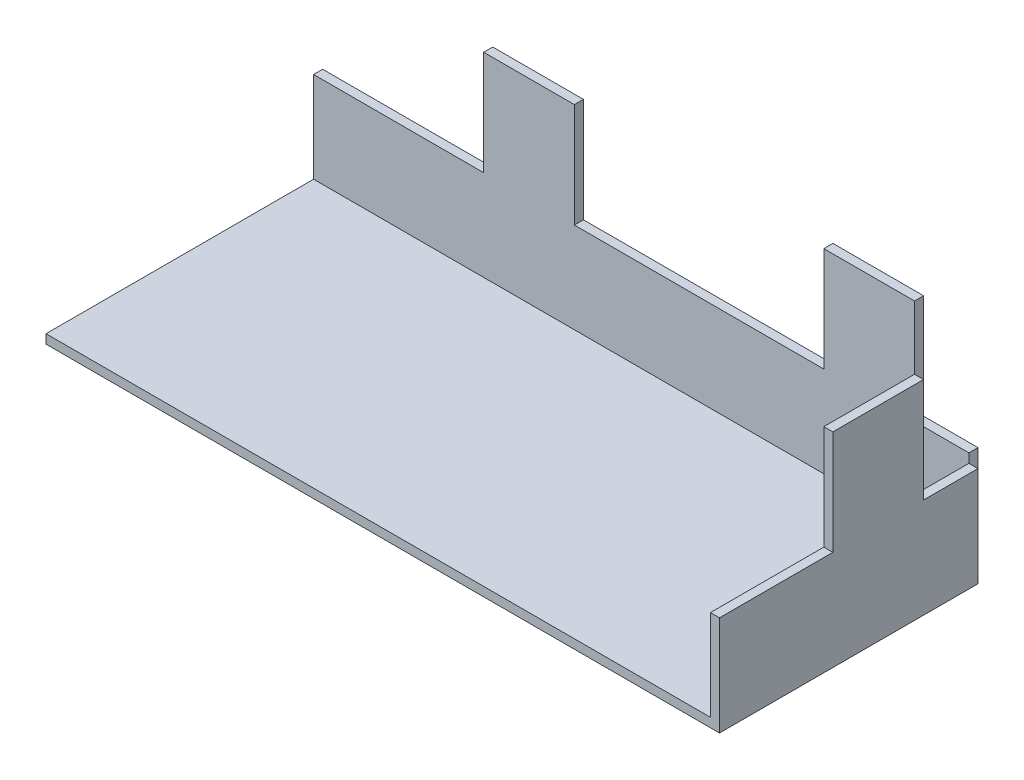
ISO-10303-21;
HEADER;
FILE_DESCRIPTION(('STEP AP214'),'2;1');
FILE_NAME('part.step','',(''),(''),'','','');
FILE_SCHEMA(('AUTOMOTIVE_DESIGN { 1 0 10303 214 1 1 1 1 }'));
ENDSEC;
DATA;
#1=APPLICATION_CONTEXT('core data for automotive mechanical design processes');
#2=APPLICATION_PROTOCOL_DEFINITION('international standard','automotive_design',2000,#1);
#3=PRODUCT_CONTEXT('',#1,'mechanical');
#4=PRODUCT('Part','Part','',(#3));
#5=PRODUCT_RELATED_PRODUCT_CATEGORY('part','',(#4));
#6=PRODUCT_DEFINITION_FORMATION('','',#4);
#7=PRODUCT_DEFINITION_CONTEXT('part definition',#1,'design');
#8=PRODUCT_DEFINITION('design','',#6,#7);
#9=PRODUCT_DEFINITION_SHAPE('','',#8);
#10=(LENGTH_UNIT() NAMED_UNIT(*) SI_UNIT(.MILLI.,.METRE.));
#11=(NAMED_UNIT(*) PLANE_ANGLE_UNIT() SI_UNIT($,.RADIAN.));
#12=(NAMED_UNIT(*) SI_UNIT($,.STERADIAN.) SOLID_ANGLE_UNIT());
#13=UNCERTAINTY_MEASURE_WITH_UNIT(LENGTH_MEASURE(1.E-05),#10,'distance_accuracy_value','');
#14=(GEOMETRIC_REPRESENTATION_CONTEXT(3) GLOBAL_UNCERTAINTY_ASSIGNED_CONTEXT((#13)) GLOBAL_UNIT_ASSIGNED_CONTEXT((#10,
#11,#12)) REPRESENTATION_CONTEXT('',''));
#15=CARTESIAN_POINT('',(0.,0.,0.));
#16=DIRECTION('',(0.,0.,1.));
#17=DIRECTION('',(1.,0.,0.));
#18=AXIS2_PLACEMENT_3D('',#15,#16,#17);
#19=CARTESIAN_POINT('',(0.,0.,-6.1));
#20=DIRECTION('',(0.,0.,-1.));
#21=DIRECTION('',(-1.,0.,0.));
#22=AXIS2_PLACEMENT_3D('',#19,#20,#21);
#23=PLANE('',#22);
#24=DIRECTION('',(0.,-1.,0.));
#25=VECTOR('',#24,1.);
#26=CARTESIAN_POINT('',(14.85,0.,-6.1));
#27=LINE('',#26,#25);
#28=CARTESIAN_POINT('',(14.85,0.,-6.10000000000355));
#29=VERTEX_POINT('',#28);
#30=CARTESIAN_POINT('',(14.85,-0.2,-6.10000000000355));
#31=VERTEX_POINT('',#30);
#32=EDGE_CURVE('E40',#29,#31,#27,.T.);
#33=ORIENTED_EDGE('',*,*,#32,.T.);
#34=DIRECTION('',(1.,0.,0.));
#35=VECTOR('',#34,1.);
#36=CARTESIAN_POINT('',(0.,-0.2,-6.1));
#37=LINE('',#36,#35);
#38=CARTESIAN_POINT('',(29.7,-0.2,-6.1));
#39=VERTEX_POINT('',#38);
#40=EDGE_CURVE('E138',#31,#39,#37,.T.);
#41=ORIENTED_EDGE('',*,*,#40,.T.);
#42=DIRECTION('',(0.,-1.,0.));
#43=VECTOR('',#42,1.);
#44=CARTESIAN_POINT('',(29.7,2.,-6.1));
#45=LINE('',#44,#43);
#46=CARTESIAN_POINT('',(29.7,2.,-6.1));
#47=VERTEX_POINT('',#46);
#48=EDGE_CURVE('E164',#47,#39,#45,.T.);
#49=ORIENTED_EDGE('',*,*,#48,.F.);
#50=DIRECTION('',(1.,0.,0.));
#51=VECTOR('',#50,1.);
#52=CARTESIAN_POINT('',(0.,2.,-6.1));
#53=LINE('',#52,#51);
#54=CARTESIAN_POINT('',(29.5,2.,-6.1));
#55=VERTEX_POINT('',#54);
#56=EDGE_CURVE('E173',#55,#47,#53,.T.);
#57=ORIENTED_EDGE('',*,*,#56,.F.);
#58=DIRECTION('',(0.,-1.,0.));
#59=VECTOR('',#58,1.);
#60=CARTESIAN_POINT('',(29.5,2.,-6.1));
#61=LINE('',#60,#59);
#62=CARTESIAN_POINT('',(29.5,0.,-6.1));
#63=VERTEX_POINT('',#62);
#64=EDGE_CURVE('E143',#55,#63,#61,.T.);
#65=ORIENTED_EDGE('',*,*,#64,.T.);
#66=DIRECTION('',(1.,0.,0.));
#67=VECTOR('',#66,1.);
#68=CARTESIAN_POINT('',(0.,0.,-6.1));
#69=LINE('',#68,#67);
#70=EDGE_CURVE('E137',#29,#63,#69,.T.);
#71=ORIENTED_EDGE('',*,*,#70,.F.);
#72=EDGE_LOOP('',(#33,#41,#49,#57,#65,#71));
#73=FACE_BOUND('',#72,.T.);
#74=ADVANCED_FACE('F36',(#73),#23,.F.);
#75=CARTESIAN_POINT('',(14.85,0.,0.));
#76=DIRECTION('',(-1.,0.,0.));
#77=DIRECTION('',(0.,0.,1.));
#78=AXIS2_PLACEMENT_3D('',#75,#76,#77);
#79=PLANE('',#78);
#80=ORIENTED_EDGE('',*,*,#32,.F.);
#81=DIRECTION('',(0.,0.,-1.));
#82=VECTOR('',#81,1.);
#83=CARTESIAN_POINT('',(14.85,0.,0.));
#84=LINE('',#83,#82);
#85=CARTESIAN_POINT('',(14.85,0.,-12.));
#86=VERTEX_POINT('',#85);
#87=EDGE_CURVE('E134',#29,#86,#84,.T.);
#88=ORIENTED_EDGE('',*,*,#87,.T.);
#89=DIRECTION('',(0.,-1.,0.));
#90=VECTOR('',#89,1.);
#91=CARTESIAN_POINT('',(14.85,2.,-12.));
#92=LINE('',#91,#90);
#93=CARTESIAN_POINT('',(14.85,2.,-12.));
#94=VERTEX_POINT('',#93);
#95=EDGE_CURVE('E167',#94,#86,#92,.T.);
#96=ORIENTED_EDGE('',*,*,#95,.F.);
#97=DIRECTION('',(0.,0.,-1.));
#98=VECTOR('',#97,1.);
#99=CARTESIAN_POINT('',(14.85,2.,0.));
#100=LINE('',#99,#98);
#101=CARTESIAN_POINT('',(14.85,2.,-12.2));
#102=VERTEX_POINT('',#101);
#103=EDGE_CURVE('E145',#94,#102,#100,.T.);
#104=ORIENTED_EDGE('',*,*,#103,.T.);
#105=DIRECTION('',(0.,-1.,0.));
#106=VECTOR('',#105,1.);
#107=CARTESIAN_POINT('',(14.85,2.,-12.2));
#108=LINE('',#107,#106);
#109=CARTESIAN_POINT('',(14.85,-0.2,-12.2));
#110=VERTEX_POINT('',#109);
#111=EDGE_CURVE('E141',#102,#110,#108,.T.);
#112=ORIENTED_EDGE('',*,*,#111,.T.);
#113=DIRECTION('',(0.,0.,-1.));
#114=VECTOR('',#113,1.);
#115=CARTESIAN_POINT('',(14.85,-0.2,0.));
#116=LINE('',#115,#114);
#117=EDGE_CURVE('E90',#31,#110,#116,.T.);
#118=ORIENTED_EDGE('',*,*,#117,.F.);
#119=EDGE_LOOP('',(#80,#88,#96,#104,#112,#118));
#120=FACE_BOUND('',#119,.T.);
#121=ADVANCED_FACE('F163',(#120),#79,.T.);
#122=CARTESIAN_POINT('',(0.,0.,0.));
#123=DIRECTION('',(0.,-1.,0.));
#124=DIRECTION('',(0.,0.,-1.));
#125=AXIS2_PLACEMENT_3D('',#122,#123,#124);
#126=PLANE('',#125);
#127=ORIENTED_EDGE('',*,*,#87,.F.);
#128=ORIENTED_EDGE('',*,*,#70,.T.);
#129=DIRECTION('',(0.,0.,-1.));
#130=VECTOR('',#129,1.);
#131=CARTESIAN_POINT('',(29.5,0.,-0.2));
#132=LINE('',#131,#130);
#133=CARTESIAN_POINT('',(29.5,0.,-11.8));
#134=VERTEX_POINT('',#133);
#135=EDGE_CURVE('E116',#63,#134,#132,.T.);
#136=ORIENTED_EDGE('',*,*,#135,.T.);
#137=DIRECTION('',(1.,0.,0.));
#138=VECTOR('',#137,1.);
#139=CARTESIAN_POINT('',(0.,0.,-11.8));
#140=LINE('',#139,#138);
#141=CARTESIAN_POINT('',(29.3,0.,-11.8));
#142=VERTEX_POINT('',#141);
#143=EDGE_CURVE('E94',#142,#134,#140,.T.);
#144=ORIENTED_EDGE('',*,*,#143,.F.);
#145=DIRECTION('',(0.,0.,1.));
#146=VECTOR('',#145,1.);
#147=CARTESIAN_POINT('',(29.3,0.,0.));
#148=LINE('',#147,#146);
#149=CARTESIAN_POINT('',(29.3,0.,-12.));
#150=VERTEX_POINT('',#149);
#151=EDGE_CURVE('E107',#150,#142,#148,.T.);
#152=ORIENTED_EDGE('',*,*,#151,.F.);
#153=DIRECTION('',(-1.,0.,0.));
#154=VECTOR('',#153,1.);
#155=CARTESIAN_POINT('',(0.2,0.,-12.));
#156=LINE('',#155,#154);
#157=EDGE_CURVE('E121',#150,#86,#156,.T.);
#158=ORIENTED_EDGE('',*,*,#157,.T.);
#159=EDGE_LOOP('',(#127,#128,#136,#144,#152,#158));
#160=FACE_BOUND('',#159,.T.);
#161=ADVANCED_FACE('F404',(#160),#126,.F.);
#162=CARTESIAN_POINT('',(0.,-0.2,0.));
#163=DIRECTION('',(0.,-1.,0.));
#164=DIRECTION('',(0.,0.,-1.));
#165=AXIS2_PLACEMENT_3D('',#162,#163,#164);
#166=PLANE('',#165);
#167=ORIENTED_EDGE('',*,*,#40,.F.);
#168=ORIENTED_EDGE('',*,*,#117,.T.);
#169=DIRECTION('',(1.,0.,0.));
#170=VECTOR('',#169,1.);
#171=CARTESIAN_POINT('',(0.,-0.2,-12.2));
#172=LINE('',#171,#170);
#173=CARTESIAN_POINT('',(29.3,-0.2,-12.2));
#174=VERTEX_POINT('',#173);
#175=EDGE_CURVE('E85',#110,#174,#172,.T.);
#176=ORIENTED_EDGE('',*,*,#175,.T.);
#177=DIRECTION('',(0.,0.,1.));
#178=VECTOR('',#177,1.);
#179=CARTESIAN_POINT('',(29.3,-0.2,-12.2));
#180=LINE('',#179,#178);
#181=CARTESIAN_POINT('',(29.3,-0.2,-11.8));
#182=VERTEX_POINT('',#181);
#183=EDGE_CURVE('E46',#174,#182,#180,.T.);
#184=ORIENTED_EDGE('',*,*,#183,.T.);
#185=DIRECTION('',(1.,0.,0.));
#186=VECTOR('',#185,1.);
#187=CARTESIAN_POINT('',(29.7,-0.2,-11.8));
#188=LINE('',#187,#186);
#189=CARTESIAN_POINT('',(29.7,-0.2,-11.8));
#190=VERTEX_POINT('',#189);
#191=EDGE_CURVE('E11',#182,#190,#188,.T.);
#192=ORIENTED_EDGE('',*,*,#191,.T.);
#193=DIRECTION('',(0.,0.,1.));
#194=VECTOR('',#193,1.);
#195=CARTESIAN_POINT('',(29.7,-0.2,0.));
#196=LINE('',#195,#194);
#197=EDGE_CURVE('E95',#190,#39,#196,.T.);
#198=ORIENTED_EDGE('',*,*,#197,.T.);
#199=EDGE_LOOP('',(#167,#168,#176,#184,#192,#198));
#200=FACE_BOUND('',#199,.T.);
#201=ADVANCED_FACE('F87',(#200),#166,.T.);
#202=CARTESIAN_POINT('',(0.,2.,-12.2));
#203=DIRECTION('',(0.,0.,1.));
#204=DIRECTION('',(1.,0.,0.));
#205=AXIS2_PLACEMENT_3D('',#202,#203,#204);
#206=PLANE('',#205);
#207=ORIENTED_EDGE('',*,*,#111,.F.);
#208=DIRECTION('',(-1.,0.,0.));
#209=VECTOR('',#208,1.);
#210=CARTESIAN_POINT('',(0.,2.,-12.2));
#211=LINE('',#210,#209);
#212=CARTESIAN_POINT('',(18.6,2.,-12.2));
#213=VERTEX_POINT('',#212);
#214=EDGE_CURVE('E133',#213,#102,#211,.T.);
#215=ORIENTED_EDGE('',*,*,#214,.F.);
#216=DIRECTION('',(0.,-1.,0.));
#217=VECTOR('',#216,1.);
#218=CARTESIAN_POINT('',(18.6,4.3,-12.2));
#219=LINE('',#218,#217);
#220=CARTESIAN_POINT('',(18.6,4.3,-12.2));
#221=VERTEX_POINT('',#220);
#222=EDGE_CURVE('E233',#221,#213,#219,.T.);
#223=ORIENTED_EDGE('',*,*,#222,.F.);
#224=DIRECTION('',(1.,0.,0.));
#225=VECTOR('',#224,1.);
#226=CARTESIAN_POINT('',(20.6,4.3,-12.2));
#227=LINE('',#226,#225);
#228=CARTESIAN_POINT('',(20.6,4.3,-12.2));
#229=VERTEX_POINT('',#228);
#230=EDGE_CURVE('E263',#221,#229,#227,.T.);
#231=ORIENTED_EDGE('',*,*,#230,.T.);
#232=DIRECTION('',(0.,-1.,0.));
#233=VECTOR('',#232,1.);
#234=CARTESIAN_POINT('',(20.6,4.3,-12.2));
#235=LINE('',#234,#233);
#236=CARTESIAN_POINT('',(20.6,2.,-12.2));
#237=VERTEX_POINT('',#236);
#238=EDGE_CURVE('E215',#229,#237,#235,.T.);
#239=ORIENTED_EDGE('',*,*,#238,.T.);
#240=CARTESIAN_POINT('',(26.1,2.,-12.2));
#241=VERTEX_POINT('',#240);
#242=EDGE_CURVE('E182',#241,#237,#211,.T.);
#243=ORIENTED_EDGE('',*,*,#242,.F.);
#244=DIRECTION('',(0.,-1.,0.));
#245=VECTOR('',#244,1.);
#246=CARTESIAN_POINT('',(26.1,4.3,-12.2));
#247=LINE('',#246,#245);
#248=CARTESIAN_POINT('',(26.1,4.3,-12.2));
#249=VERTEX_POINT('',#248);
#250=EDGE_CURVE('E193',#249,#241,#247,.T.);
#251=ORIENTED_EDGE('',*,*,#250,.F.);
#252=DIRECTION('',(1.,0.,0.));
#253=VECTOR('',#252,1.);
#254=CARTESIAN_POINT('',(28.1,4.3,-12.2));
#255=LINE('',#254,#253);
#256=CARTESIAN_POINT('',(28.1,4.3,-12.2));
#257=VERTEX_POINT('',#256);
#258=EDGE_CURVE('E223',#249,#257,#255,.T.);
#259=ORIENTED_EDGE('',*,*,#258,.T.);
#260=DIRECTION('',(0.,-1.,0.));
#261=VECTOR('',#260,1.);
#262=CARTESIAN_POINT('',(28.1,4.3,-12.2));
#263=LINE('',#262,#261);
#264=CARTESIAN_POINT('',(28.1,2.,-12.2));
#265=VERTEX_POINT('',#264);
#266=EDGE_CURVE('E120',#257,#265,#263,.T.);
#267=ORIENTED_EDGE('',*,*,#266,.T.);
#268=CARTESIAN_POINT('',(29.3,2.,-12.2));
#269=VERTEX_POINT('',#268);
#270=EDGE_CURVE('E106',#269,#265,#211,.T.);
#271=ORIENTED_EDGE('',*,*,#270,.F.);
#272=DIRECTION('',(0.,-1.,0.));
#273=VECTOR('',#272,1.);
#274=CARTESIAN_POINT('',(29.3,2.,-12.2));
#275=LINE('',#274,#273);
#276=EDGE_CURVE('E67',#269,#174,#275,.T.);
#277=ORIENTED_EDGE('',*,*,#276,.T.);
#278=ORIENTED_EDGE('',*,*,#175,.F.);
#279=EDGE_LOOP('',(#207,#215,#223,#231,#239,#243,#251,#259,#267,#271,#277,#278));
#280=FACE_BOUND('',#279,.T.);
#281=ADVANCED_FACE('F103',(#280),#206,.F.);
#282=CARTESIAN_POINT('',(0.2,2.,-12.));
#283=DIRECTION('',(0.,0.,1.));
#284=DIRECTION('',(1.,0.,0.));
#285=AXIS2_PLACEMENT_3D('',#282,#283,#284);
#286=PLANE('',#285);
#287=DIRECTION('',(-1.,0.,0.));
#288=VECTOR('',#287,1.);
#289=CARTESIAN_POINT('',(0.2,2.,-12.));
#290=LINE('',#289,#288);
#291=CARTESIAN_POINT('',(18.6,2.,-12.));
#292=VERTEX_POINT('',#291);
#293=EDGE_CURVE('E127',#292,#94,#290,.T.);
#294=ORIENTED_EDGE('',*,*,#293,.T.);
#295=ORIENTED_EDGE('',*,*,#95,.T.);
#296=ORIENTED_EDGE('',*,*,#157,.F.);
#297=DIRECTION('',(0.,1.,0.));
#298=VECTOR('',#297,1.);
#299=CARTESIAN_POINT('',(29.3,2.,-12.));
#300=LINE('',#299,#298);
#301=CARTESIAN_POINT('',(29.3,2.,-12.));
#302=VERTEX_POINT('',#301);
#303=EDGE_CURVE('E177',#150,#302,#300,.T.);
#304=ORIENTED_EDGE('',*,*,#303,.T.);
#305=CARTESIAN_POINT('',(28.1,2.,-12.));
#306=VERTEX_POINT('',#305);
#307=EDGE_CURVE('E186',#302,#306,#290,.T.);
#308=ORIENTED_EDGE('',*,*,#307,.T.);
#309=DIRECTION('',(0.,-1.,0.));
#310=VECTOR('',#309,1.);
#311=CARTESIAN_POINT('',(28.1,4.3,-12.));
#312=LINE('',#311,#310);
#313=CARTESIAN_POINT('',(28.1,4.3,-12.));
#314=VERTEX_POINT('',#313);
#315=EDGE_CURVE('E201',#314,#306,#312,.T.);
#316=ORIENTED_EDGE('',*,*,#315,.F.);
#317=DIRECTION('',(-1.,0.,0.));
#318=VECTOR('',#317,1.);
#319=CARTESIAN_POINT('',(28.1,4.3,-12.));
#320=LINE('',#319,#318);
#321=CARTESIAN_POINT('',(26.1,4.3,-12.));
#322=VERTEX_POINT('',#321);
#323=EDGE_CURVE('E205',#314,#322,#320,.T.);
#324=ORIENTED_EDGE('',*,*,#323,.T.);
#325=DIRECTION('',(0.,-1.,0.));
#326=VECTOR('',#325,1.);
#327=CARTESIAN_POINT('',(26.1,4.3,-12.));
#328=LINE('',#327,#326);
#329=CARTESIAN_POINT('',(26.1,2.,-12.));
#330=VERTEX_POINT('',#329);
#331=EDGE_CURVE('E197',#322,#330,#328,.T.);
#332=ORIENTED_EDGE('',*,*,#331,.T.);
#333=CARTESIAN_POINT('',(20.6,2.,-12.));
#334=VERTEX_POINT('',#333);
#335=EDGE_CURVE('E190',#330,#334,#290,.T.);
#336=ORIENTED_EDGE('',*,*,#335,.T.);
#337=DIRECTION('',(0.,-1.,0.));
#338=VECTOR('',#337,1.);
#339=CARTESIAN_POINT('',(20.6,4.3,-12.));
#340=LINE('',#339,#338);
#341=CARTESIAN_POINT('',(20.6,4.3,-12.));
#342=VERTEX_POINT('',#341);
#343=EDGE_CURVE('E241',#342,#334,#340,.T.);
#344=ORIENTED_EDGE('',*,*,#343,.F.);
#345=DIRECTION('',(-1.,0.,0.));
#346=VECTOR('',#345,1.);
#347=CARTESIAN_POINT('',(20.6,4.3,-12.));
#348=LINE('',#347,#346);
#349=CARTESIAN_POINT('',(18.6,4.3,-12.));
#350=VERTEX_POINT('',#349);
#351=EDGE_CURVE('E245',#342,#350,#348,.T.);
#352=ORIENTED_EDGE('',*,*,#351,.T.);
#353=DIRECTION('',(0.,-1.,0.));
#354=VECTOR('',#353,1.);
#355=CARTESIAN_POINT('',(18.6,4.3,-12.));
#356=LINE('',#355,#354);
#357=EDGE_CURVE('E237',#350,#292,#356,.T.);
#358=ORIENTED_EDGE('',*,*,#357,.T.);
#359=EDGE_LOOP('',(#294,#295,#296,#304,#308,#316,#324,#332,#336,#344,#352,#358));
#360=FACE_BOUND('',#359,.T.);
#361=ADVANCED_FACE('F406',(#360),#286,.T.);
#362=CARTESIAN_POINT('',(0.,2.,0.));
#363=DIRECTION('',(0.,-1.,0.));
#364=DIRECTION('',(0.,0.,-1.));
#365=AXIS2_PLACEMENT_3D('',#362,#363,#364);
#366=PLANE('',#365);
#367=ORIENTED_EDGE('',*,*,#103,.F.);
#368=ORIENTED_EDGE('',*,*,#293,.F.);
#369=DIRECTION('',(0.,0.,-1.));
#370=VECTOR('',#369,1.);
#371=CARTESIAN_POINT('',(18.6,2.,-12.));
#372=LINE('',#371,#370);
#373=EDGE_CURVE('E246',#292,#213,#372,.T.);
#374=ORIENTED_EDGE('',*,*,#373,.T.);
#375=ORIENTED_EDGE('',*,*,#214,.T.);
#376=EDGE_LOOP('',(#367,#368,#374,#375));
#377=FACE_BOUND('',#376,.T.);
#378=ADVANCED_FACE('F436',(#377),#366,.F.);
#379=DIRECTION('',(0.,0.,1.));
#380=VECTOR('',#379,1.);
#381=CARTESIAN_POINT('',(29.3,2.,-12.2));
#382=LINE('',#381,#380);
#383=EDGE_CURVE('E113',#269,#302,#382,.T.);
#384=ORIENTED_EDGE('',*,*,#383,.F.);
#385=ORIENTED_EDGE('',*,*,#270,.T.);
#386=DIRECTION('',(0.,0.,1.));
#387=VECTOR('',#386,1.);
#388=CARTESIAN_POINT('',(28.1,2.,-12.));
#389=LINE('',#388,#387);
#390=EDGE_CURVE('E210',#265,#306,#389,.T.);
#391=ORIENTED_EDGE('',*,*,#390,.T.);
#392=ORIENTED_EDGE('',*,*,#307,.F.);
#393=EDGE_LOOP('',(#384,#385,#391,#392));
#394=FACE_BOUND('',#393,.T.);
#395=ADVANCED_FACE('F433',(#394),#366,.F.);
#396=DIRECTION('',(1.,0.,0.));
#397=VECTOR('',#396,1.);
#398=CARTESIAN_POINT('',(29.7,2.,-11.8));
#399=LINE('',#398,#397);
#400=CARTESIAN_POINT('',(29.5,2.,-11.8));
#401=VERTEX_POINT('',#400);
#402=CARTESIAN_POINT('',(29.7,2.,-11.8));
#403=VERTEX_POINT('',#402);
#404=EDGE_CURVE('E100',#401,#403,#399,.T.);
#405=ORIENTED_EDGE('',*,*,#404,.F.);
#406=DIRECTION('',(0.,0.,-1.));
#407=VECTOR('',#406,1.);
#408=CARTESIAN_POINT('',(29.5,2.,-0.2));
#409=LINE('',#408,#407);
#410=CARTESIAN_POINT('',(29.5,2.,-10.6));
#411=VERTEX_POINT('',#410);
#412=EDGE_CURVE('E126',#411,#401,#409,.T.);
#413=ORIENTED_EDGE('',*,*,#412,.F.);
#414=DIRECTION('',(1.,0.,0.));
#415=VECTOR('',#414,1.);
#416=CARTESIAN_POINT('',(29.5,2.,-10.6));
#417=LINE('',#416,#415);
#418=CARTESIAN_POINT('',(29.7,2.,-10.6));
#419=VERTEX_POINT('',#418);
#420=EDGE_CURVE('E286',#411,#419,#417,.T.);
#421=ORIENTED_EDGE('',*,*,#420,.T.);
#422=DIRECTION('',(0.,0.,-1.));
#423=VECTOR('',#422,1.);
#424=CARTESIAN_POINT('',(29.7,2.,0.));
#425=LINE('',#424,#423);
#426=EDGE_CURVE('E132',#419,#403,#425,.T.);
#427=ORIENTED_EDGE('',*,*,#426,.T.);
#428=EDGE_LOOP('',(#405,#413,#421,#427));
#429=FACE_BOUND('',#428,.T.);
#430=ADVANCED_FACE('F435',(#429),#366,.F.);
#431=CARTESIAN_POINT('',(29.7,2.,0.));
#432=DIRECTION('',(-1.,0.,0.));
#433=DIRECTION('',(0.,0.,1.));
#434=AXIS2_PLACEMENT_3D('',#431,#432,#433);
#435=PLANE('',#434);
#436=CARTESIAN_POINT('',(29.7,2.,-8.6));
#437=VERTEX_POINT('',#436);
#438=EDGE_CURVE('E128',#47,#437,#425,.T.);
#439=ORIENTED_EDGE('',*,*,#438,.F.);
#440=ORIENTED_EDGE('',*,*,#48,.T.);
#441=ORIENTED_EDGE('',*,*,#197,.F.);
#442=DIRECTION('',(0.,-1.,0.));
#443=VECTOR('',#442,1.);
#444=CARTESIAN_POINT('',(29.7,2.,-11.8));
#445=LINE('',#444,#443);
#446=EDGE_CURVE('E55',#403,#190,#445,.T.);
#447=ORIENTED_EDGE('',*,*,#446,.F.);
#448=ORIENTED_EDGE('',*,*,#426,.F.);
#449=DIRECTION('',(0.,-1.,0.));
#450=VECTOR('',#449,1.);
#451=CARTESIAN_POINT('',(29.7,4.3,-10.6));
#452=LINE('',#451,#450);
#453=CARTESIAN_POINT('',(29.7,4.3,-10.6));
#454=VERTEX_POINT('',#453);
#455=EDGE_CURVE('E277',#454,#419,#452,.T.);
#456=ORIENTED_EDGE('',*,*,#455,.F.);
#457=DIRECTION('',(0.,0.,1.));
#458=VECTOR('',#457,1.);
#459=CARTESIAN_POINT('',(29.7,4.3,-10.6));
#460=LINE('',#459,#458);
#461=CARTESIAN_POINT('',(29.7,4.3,-8.6));
#462=VERTEX_POINT('',#461);
#463=EDGE_CURVE('E298',#454,#462,#460,.T.);
#464=ORIENTED_EDGE('',*,*,#463,.T.);
#465=DIRECTION('',(0.,-1.,0.));
#466=VECTOR('',#465,1.);
#467=CARTESIAN_POINT('',(29.7,4.3,-8.6));
#468=LINE('',#467,#466);
#469=EDGE_CURVE('E273',#462,#437,#468,.T.);
#470=ORIENTED_EDGE('',*,*,#469,.T.);
#471=EDGE_LOOP('',(#439,#440,#441,#447,#448,#456,#464,#470));
#472=FACE_BOUND('',#471,.T.);
#473=ADVANCED_FACE('F441',(#472),#435,.F.);
#474=CARTESIAN_POINT('',(29.5,2.,-0.2));
#475=DIRECTION('',(-1.,0.,0.));
#476=DIRECTION('',(0.,0.,1.));
#477=AXIS2_PLACEMENT_3D('',#474,#475,#476);
#478=PLANE('',#477);
#479=ORIENTED_EDGE('',*,*,#64,.F.);
#480=CARTESIAN_POINT('',(29.5,2.,-8.6));
#481=VERTEX_POINT('',#480);
#482=EDGE_CURVE('E122',#55,#481,#409,.T.);
#483=ORIENTED_EDGE('',*,*,#482,.T.);
#484=DIRECTION('',(0.,-1.,0.));
#485=VECTOR('',#484,1.);
#486=CARTESIAN_POINT('',(29.5,4.3,-8.6));
#487=LINE('',#486,#485);
#488=CARTESIAN_POINT('',(29.5,4.3,-8.6));
#489=VERTEX_POINT('',#488);
#490=EDGE_CURVE('E255',#489,#481,#487,.T.);
#491=ORIENTED_EDGE('',*,*,#490,.F.);
#492=DIRECTION('',(0.,0.,-1.));
#493=VECTOR('',#492,1.);
#494=CARTESIAN_POINT('',(29.5,4.3,-10.6));
#495=LINE('',#494,#493);
#496=CARTESIAN_POINT('',(29.5,4.3,-10.6));
#497=VERTEX_POINT('',#496);
#498=EDGE_CURVE('E291',#489,#497,#495,.T.);
#499=ORIENTED_EDGE('',*,*,#498,.T.);
#500=DIRECTION('',(0.,-1.,0.));
#501=VECTOR('',#500,1.);
#502=CARTESIAN_POINT('',(29.5,4.3,-10.6));
#503=LINE('',#502,#501);
#504=EDGE_CURVE('E281',#497,#411,#503,.T.);
#505=ORIENTED_EDGE('',*,*,#504,.T.);
#506=ORIENTED_EDGE('',*,*,#412,.T.);
#507=DIRECTION('',(0.,-1.,0.));
#508=VECTOR('',#507,1.);
#509=CARTESIAN_POINT('',(29.5,2.,-11.8));
#510=LINE('',#509,#508);
#511=EDGE_CURVE('E74',#401,#134,#510,.T.);
#512=ORIENTED_EDGE('',*,*,#511,.T.);
#513=ORIENTED_EDGE('',*,*,#135,.F.);
#514=EDGE_LOOP('',(#479,#483,#491,#499,#505,#506,#512,#513));
#515=FACE_BOUND('',#514,.T.);
#516=ADVANCED_FACE('F321',(#515),#478,.T.);
#517=ORIENTED_EDGE('',*,*,#482,.F.);
#518=ORIENTED_EDGE('',*,*,#56,.T.);
#519=ORIENTED_EDGE('',*,*,#438,.T.);
#520=DIRECTION('',(-1.,0.,0.));
#521=VECTOR('',#520,1.);
#522=CARTESIAN_POINT('',(29.5,2.,-8.6));
#523=LINE('',#522,#521);
#524=EDGE_CURVE('E290',#437,#481,#523,.T.);
#525=ORIENTED_EDGE('',*,*,#524,.T.);
#526=EDGE_LOOP('',(#517,#518,#519,#525));
#527=FACE_BOUND('',#526,.T.);
#528=ADVANCED_FACE('F442',(#527),#366,.F.);
#529=ORIENTED_EDGE('',*,*,#242,.T.);
#530=DIRECTION('',(0.,0.,1.));
#531=VECTOR('',#530,1.);
#532=CARTESIAN_POINT('',(20.6,2.,-12.));
#533=LINE('',#532,#531);
#534=EDGE_CURVE('E250',#237,#334,#533,.T.);
#535=ORIENTED_EDGE('',*,*,#534,.T.);
#536=ORIENTED_EDGE('',*,*,#335,.F.);
#537=DIRECTION('',(0.,0.,-1.));
#538=VECTOR('',#537,1.);
#539=CARTESIAN_POINT('',(26.1,2.,-12.));
#540=LINE('',#539,#538);
#541=EDGE_CURVE('E206',#330,#241,#540,.T.);
#542=ORIENTED_EDGE('',*,*,#541,.T.);
#543=EDGE_LOOP('',(#529,#535,#536,#542));
#544=FACE_BOUND('',#543,.T.);
#545=ADVANCED_FACE('F38',(#544),#366,.F.);
#546=CARTESIAN_POINT('',(28.1,4.3,-12.));
#547=DIRECTION('',(1.,0.,0.));
#548=DIRECTION('',(0.,0.,-1.));
#549=AXIS2_PLACEMENT_3D('',#546,#547,#548);
#550=PLANE('',#549);
#551=ORIENTED_EDGE('',*,*,#390,.F.);
#552=ORIENTED_EDGE('',*,*,#266,.F.);
#553=DIRECTION('',(0.,0.,1.));
#554=VECTOR('',#553,1.);
#555=CARTESIAN_POINT('',(28.1,4.3,-12.));
#556=LINE('',#555,#554);
#557=EDGE_CURVE('E211',#257,#314,#556,.T.);
#558=ORIENTED_EDGE('',*,*,#557,.T.);
#559=ORIENTED_EDGE('',*,*,#315,.T.);
#560=EDGE_LOOP('',(#551,#552,#558,#559));
#561=FACE_BOUND('',#560,.T.);
#562=ADVANCED_FACE('F431',(#561),#550,.T.);
#563=CARTESIAN_POINT('',(26.1,4.3,-12.));
#564=DIRECTION('',(-1.,0.,0.));
#565=DIRECTION('',(0.,0.,1.));
#566=AXIS2_PLACEMENT_3D('',#563,#564,#565);
#567=PLANE('',#566);
#568=ORIENTED_EDGE('',*,*,#541,.F.);
#569=ORIENTED_EDGE('',*,*,#331,.F.);
#570=DIRECTION('',(0.,0.,-1.));
#571=VECTOR('',#570,1.);
#572=CARTESIAN_POINT('',(26.1,4.3,-12.));
#573=LINE('',#572,#571);
#574=EDGE_CURVE('E219',#322,#249,#573,.T.);
#575=ORIENTED_EDGE('',*,*,#574,.T.);
#576=ORIENTED_EDGE('',*,*,#250,.T.);
#577=EDGE_LOOP('',(#568,#569,#575,#576));
#578=FACE_BOUND('',#577,.T.);
#579=ADVANCED_FACE('F423',(#578),#567,.T.);
#580=CARTESIAN_POINT('',(0.,4.3,-12.2));
#581=DIRECTION('',(0.,-1.,0.));
#582=DIRECTION('',(0.,0.,1.));
#583=AXIS2_PLACEMENT_3D('',#580,#581,#582);
#584=PLANE('',#583);
#585=ORIENTED_EDGE('',*,*,#557,.F.);
#586=ORIENTED_EDGE('',*,*,#258,.F.);
#587=ORIENTED_EDGE('',*,*,#574,.F.);
#588=ORIENTED_EDGE('',*,*,#323,.F.);
#589=EDGE_LOOP('',(#585,#586,#587,#588));
#590=FACE_BOUND('',#589,.T.);
#591=ADVANCED_FACE('F428',(#590),#584,.F.);
#592=CARTESIAN_POINT('',(20.6,4.3,-12.));
#593=DIRECTION('',(1.,0.,0.));
#594=DIRECTION('',(0.,0.,-1.));
#595=AXIS2_PLACEMENT_3D('',#592,#593,#594);
#596=PLANE('',#595);
#597=ORIENTED_EDGE('',*,*,#534,.F.);
#598=ORIENTED_EDGE('',*,*,#238,.F.);
#599=DIRECTION('',(0.,0.,1.));
#600=VECTOR('',#599,1.);
#601=CARTESIAN_POINT('',(20.6,4.3,-12.));
#602=LINE('',#601,#600);
#603=EDGE_CURVE('E251',#229,#342,#602,.T.);
#604=ORIENTED_EDGE('',*,*,#603,.T.);
#605=ORIENTED_EDGE('',*,*,#343,.T.);
#606=EDGE_LOOP('',(#597,#598,#604,#605));
#607=FACE_BOUND('',#606,.T.);
#608=ADVANCED_FACE('F545',(#607),#596,.T.);
#609=CARTESIAN_POINT('',(18.6,4.3,-12.));
#610=DIRECTION('',(-1.,0.,0.));
#611=DIRECTION('',(0.,0.,1.));
#612=AXIS2_PLACEMENT_3D('',#609,#610,#611);
#613=PLANE('',#612);
#614=ORIENTED_EDGE('',*,*,#373,.F.);
#615=ORIENTED_EDGE('',*,*,#357,.F.);
#616=DIRECTION('',(0.,0.,-1.));
#617=VECTOR('',#616,1.);
#618=CARTESIAN_POINT('',(18.6,4.3,-12.));
#619=LINE('',#618,#617);
#620=EDGE_CURVE('E259',#350,#221,#619,.T.);
#621=ORIENTED_EDGE('',*,*,#620,.T.);
#622=ORIENTED_EDGE('',*,*,#222,.T.);
#623=EDGE_LOOP('',(#614,#615,#621,#622));
#624=FACE_BOUND('',#623,.T.);
#625=ADVANCED_FACE('F555',(#624),#613,.T.);
#626=CARTESIAN_POINT('',(-7.5,4.3,-12.2));
#627=DIRECTION('',(0.,-1.,0.));
#628=DIRECTION('',(0.,0.,1.));
#629=AXIS2_PLACEMENT_3D('',#626,#627,#628);
#630=PLANE('',#629);
#631=ORIENTED_EDGE('',*,*,#603,.F.);
#632=ORIENTED_EDGE('',*,*,#230,.F.);
#633=ORIENTED_EDGE('',*,*,#620,.F.);
#634=ORIENTED_EDGE('',*,*,#351,.F.);
#635=EDGE_LOOP('',(#631,#632,#633,#634));
#636=FACE_BOUND('',#635,.T.);
#637=ADVANCED_FACE('F566',(#636),#630,.F.);
#638=CARTESIAN_POINT('',(29.5,4.3,-8.6));
#639=DIRECTION('',(0.,0.,1.));
#640=DIRECTION('',(1.,0.,0.));
#641=AXIS2_PLACEMENT_3D('',#638,#639,#640);
#642=PLANE('',#641);
#643=ORIENTED_EDGE('',*,*,#524,.F.);
#644=ORIENTED_EDGE('',*,*,#469,.F.);
#645=DIRECTION('',(-1.,0.,0.));
#646=VECTOR('',#645,1.);
#647=CARTESIAN_POINT('',(29.5,4.3,-8.6));
#648=LINE('',#647,#646);
#649=EDGE_CURVE('E302',#462,#489,#648,.T.);
#650=ORIENTED_EDGE('',*,*,#649,.T.);
#651=ORIENTED_EDGE('',*,*,#490,.T.);
#652=EDGE_LOOP('',(#643,#644,#650,#651));
#653=FACE_BOUND('',#652,.T.);
#654=ADVANCED_FACE('F577',(#653),#642,.T.);
#655=CARTESIAN_POINT('',(29.5,4.3,-10.6));
#656=DIRECTION('',(0.,0.,-1.));
#657=DIRECTION('',(-1.,0.,0.));
#658=AXIS2_PLACEMENT_3D('',#655,#656,#657);
#659=PLANE('',#658);
#660=ORIENTED_EDGE('',*,*,#420,.F.);
#661=ORIENTED_EDGE('',*,*,#504,.F.);
#662=DIRECTION('',(1.,0.,0.));
#663=VECTOR('',#662,1.);
#664=CARTESIAN_POINT('',(29.5,4.3,-10.6));
#665=LINE('',#664,#663);
#666=EDGE_CURVE('E285',#497,#454,#665,.T.);
#667=ORIENTED_EDGE('',*,*,#666,.T.);
#668=ORIENTED_EDGE('',*,*,#455,.T.);
#669=EDGE_LOOP('',(#660,#661,#667,#668));
#670=FACE_BOUND('',#669,.T.);
#671=ADVANCED_FACE('F588',(#670),#659,.T.);
#672=CARTESIAN_POINT('',(0.,4.3,-12.2));
#673=DIRECTION('',(0.,-1.,0.));
#674=DIRECTION('',(0.,0.,1.));
#675=AXIS2_PLACEMENT_3D('',#672,#673,#674);
#676=PLANE('',#675);
#677=ORIENTED_EDGE('',*,*,#498,.F.);
#678=ORIENTED_EDGE('',*,*,#649,.F.);
#679=ORIENTED_EDGE('',*,*,#463,.F.);
#680=ORIENTED_EDGE('',*,*,#666,.F.);
#681=EDGE_LOOP('',(#677,#678,#679,#680));
#682=FACE_BOUND('',#681,.T.);
#683=ADVANCED_FACE('F599',(#682),#676,.F.);
#684=CARTESIAN_POINT('',(29.7,2.,-11.8));
#685=DIRECTION('',(0.,0.,-1.));
#686=DIRECTION('',(-1.,0.,0.));
#687=AXIS2_PLACEMENT_3D('',#684,#685,#686);
#688=PLANE('',#687);
#689=ORIENTED_EDGE('',*,*,#143,.T.);
#690=ORIENTED_EDGE('',*,*,#511,.F.);
#691=ORIENTED_EDGE('',*,*,#404,.T.);
#692=ORIENTED_EDGE('',*,*,#446,.T.);
#693=ORIENTED_EDGE('',*,*,#191,.F.);
#694=DIRECTION('',(0.,-1.,0.));
#695=VECTOR('',#694,1.);
#696=CARTESIAN_POINT('',(29.3,2.,-11.8));
#697=LINE('',#696,#695);
#698=EDGE_CURVE('E99',#142,#182,#697,.T.);
#699=ORIENTED_EDGE('',*,*,#698,.F.);
#700=EDGE_LOOP('',(#689,#690,#691,#692,#693,#699));
#701=FACE_BOUND('',#700,.T.);
#702=ADVANCED_FACE('F312',(#701),#688,.T.);
#703=CARTESIAN_POINT('',(29.3,2.,-12.2));
#704=DIRECTION('',(1.,0.,0.));
#705=DIRECTION('',(0.,0.,-1.));
#706=AXIS2_PLACEMENT_3D('',#703,#704,#705);
#707=PLANE('',#706);
#708=ORIENTED_EDGE('',*,*,#151,.T.);
#709=ORIENTED_EDGE('',*,*,#698,.T.);
#710=ORIENTED_EDGE('',*,*,#183,.F.);
#711=ORIENTED_EDGE('',*,*,#276,.F.);
#712=ORIENTED_EDGE('',*,*,#383,.T.);
#713=ORIENTED_EDGE('',*,*,#303,.F.);
#714=EDGE_LOOP('',(#708,#709,#710,#711,#712,#713));
#715=FACE_BOUND('',#714,.T.);
#716=ADVANCED_FACE('F97',(#715),#707,.T.);
#717=CLOSED_SHELL('',(#74,#121,#161,#201,#281,#361,#378,#395,#430,#473,#516,#528,#545,#562,#579,
#591,#608,#625,#637,#654,#671,#683,#702,#716));
#718=MANIFOLD_SOLID_BREP('B2',#717);
#719=ADVANCED_BREP_SHAPE_REPRESENTATION('',(#18,#718),#14);
#720=SHAPE_DEFINITION_REPRESENTATION(#9,#719);
ENDSEC;
END-ISO-10303-21;
